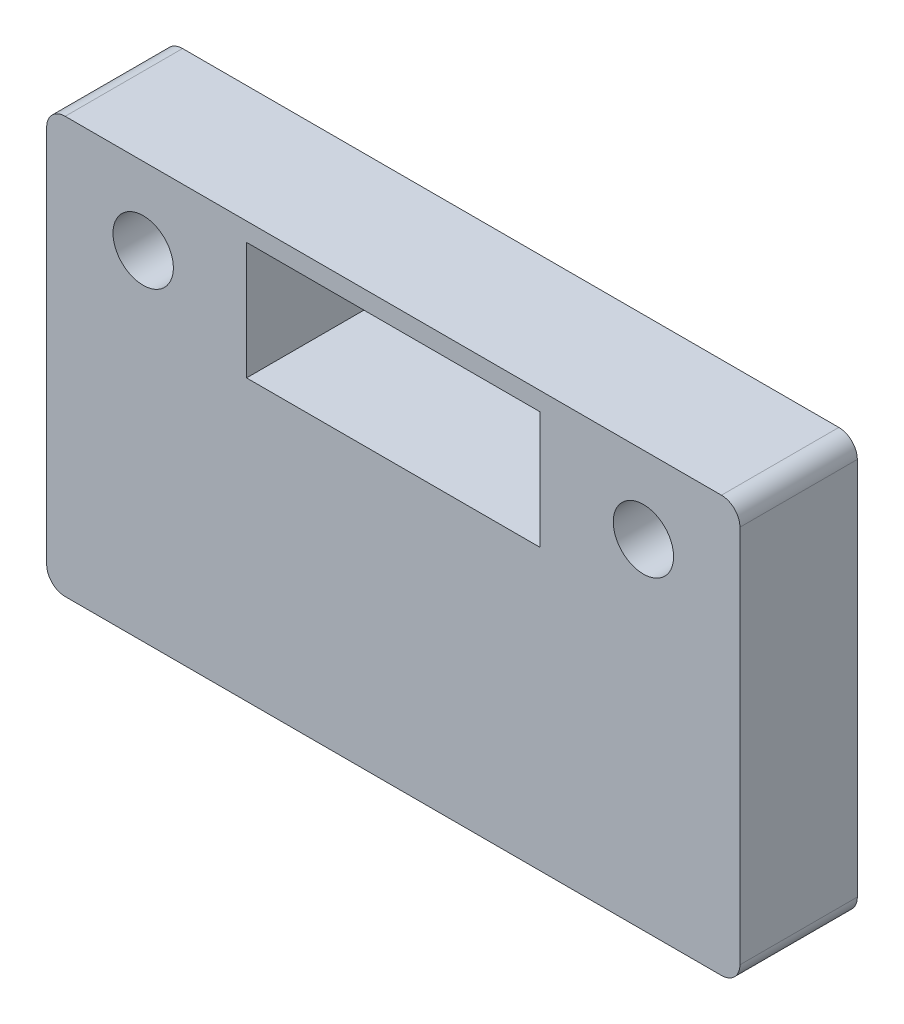
ISO-10303-21;
HEADER;
FILE_DESCRIPTION(('STEP AP214'),'2;1');
FILE_NAME('part.step','',(''),(''),'','','');
FILE_SCHEMA(('AUTOMOTIVE_DESIGN { 1 0 10303 214 1 1 1 1 }'));
ENDSEC;
DATA;
#1=APPLICATION_CONTEXT('core data for automotive mechanical design processes');
#2=APPLICATION_PROTOCOL_DEFINITION('international standard','automotive_design',2000,#1);
#3=PRODUCT_CONTEXT('',#1,'mechanical');
#4=PRODUCT('Part','Part','',(#3));
#5=PRODUCT_RELATED_PRODUCT_CATEGORY('part','',(#4));
#6=PRODUCT_DEFINITION_FORMATION('','',#4);
#7=PRODUCT_DEFINITION_CONTEXT('part definition',#1,'design');
#8=PRODUCT_DEFINITION('design','',#6,#7);
#9=PRODUCT_DEFINITION_SHAPE('','',#8);
#10=(LENGTH_UNIT() NAMED_UNIT(*) SI_UNIT(.MILLI.,.METRE.));
#11=(NAMED_UNIT(*) PLANE_ANGLE_UNIT() SI_UNIT($,.RADIAN.));
#12=(NAMED_UNIT(*) SI_UNIT($,.STERADIAN.) SOLID_ANGLE_UNIT());
#13=UNCERTAINTY_MEASURE_WITH_UNIT(LENGTH_MEASURE(1.E-05),#10,'distance_accuracy_value','');
#14=(GEOMETRIC_REPRESENTATION_CONTEXT(3) GLOBAL_UNCERTAINTY_ASSIGNED_CONTEXT((#13)) GLOBAL_UNIT_ASSIGNED_CONTEXT((#10,
#11,#12)) REPRESENTATION_CONTEXT('',''));
#15=CARTESIAN_POINT('',(0.,0.,0.));
#16=DIRECTION('',(0.,0.,1.));
#17=DIRECTION('',(1.,0.,0.));
#18=AXIS2_PLACEMENT_3D('',#15,#16,#17);
#19=CARTESIAN_POINT('',(0.,0.,12.7));
#20=DIRECTION('',(0.,0.,1.));
#21=DIRECTION('',(1.,0.,0.));
#22=AXIS2_PLACEMENT_3D('',#19,#20,#21);
#23=PLANE('',#22);
#24=CARTESIAN_POINT('',(64.56,-8.35,12.7));
#25=DIRECTION('',(0.,0.,-1.));
#26=DIRECTION('',(-1.,0.,0.));
#27=AXIS2_PLACEMENT_3D('',#24,#25,#26);
#28=CIRCLE('',#27,3.26389999999999);
#29=CARTESIAN_POINT('',(61.2961,-8.35,12.7));
#30=VERTEX_POINT('',#29);
#31=EDGE_CURVE('E467',#30,#30,#28,.T.);
#32=ORIENTED_EDGE('',*,*,#31,.T.);
#33=EDGE_LOOP('',(#32));
#34=FACE_BOUND('',#33,.T.);
#35=CARTESIAN_POINT('',(10.44,-8.35,12.7));
#36=DIRECTION('',(0.,0.,-1.));
#37=DIRECTION('',(-1.,0.,0.));
#38=AXIS2_PLACEMENT_3D('',#35,#36,#37);
#39=CIRCLE('',#38,3.26389999999999);
#40=CARTESIAN_POINT('',(7.17610000000001,-8.35,12.7));
#41=VERTEX_POINT('',#40);
#42=EDGE_CURVE('E170',#41,#41,#39,.T.);
#43=ORIENTED_EDGE('',*,*,#42,.T.);
#44=EDGE_LOOP('',(#43));
#45=FACE_BOUND('',#44,.T.);
#46=DIRECTION('',(1.,0.,0.));
#47=VECTOR('',#46,1.);
#48=CARTESIAN_POINT('',(0.,-45.,12.7));
#49=LINE('',#48,#47);
#50=CARTESIAN_POINT('',(2.00000000000001,-45.,12.7));
#51=VERTEX_POINT('',#50);
#52=CARTESIAN_POINT('',(73.,-45.,12.7));
#53=VERTEX_POINT('',#52);
#54=EDGE_CURVE('E191',#51,#53,#49,.T.);
#55=ORIENTED_EDGE('',*,*,#54,.T.);
#56=CARTESIAN_POINT('',(73.,-43.,12.7));
#57=DIRECTION('',(0.,0.,1.));
#58=DIRECTION('',(1.,0.,0.));
#59=AXIS2_PLACEMENT_3D('',#56,#57,#58);
#60=CIRCLE('',#59,2.);
#61=CARTESIAN_POINT('',(75.,-43.,12.7));
#62=VERTEX_POINT('',#61);
#63=EDGE_CURVE('E48',#53,#62,#60,.T.);
#64=ORIENTED_EDGE('',*,*,#63,.T.);
#65=DIRECTION('',(0.,1.,0.));
#66=VECTOR('',#65,1.);
#67=CARTESIAN_POINT('',(75.,0.,12.7));
#68=LINE('',#67,#66);
#69=CARTESIAN_POINT('',(75.,-2.,12.7));
#70=VERTEX_POINT('',#69);
#71=EDGE_CURVE('E195',#62,#70,#68,.T.);
#72=ORIENTED_EDGE('',*,*,#71,.T.);
#73=CARTESIAN_POINT('',(73.,-2.,12.7));
#74=DIRECTION('',(0.,0.,1.));
#75=DIRECTION('',(1.,0.,0.));
#76=AXIS2_PLACEMENT_3D('',#73,#74,#75);
#77=CIRCLE('',#76,2.);
#78=CARTESIAN_POINT('',(73.,0.,12.7));
#79=VERTEX_POINT('',#78);
#80=EDGE_CURVE('E55',#70,#79,#77,.T.);
#81=ORIENTED_EDGE('',*,*,#80,.T.);
#82=DIRECTION('',(-1.,0.,0.));
#83=VECTOR('',#82,1.);
#84=CARTESIAN_POINT('',(0.,0.,12.7));
#85=LINE('',#84,#83);
#86=CARTESIAN_POINT('',(2.,0.,12.7));
#87=VERTEX_POINT('',#86);
#88=EDGE_CURVE('E198',#79,#87,#85,.T.);
#89=ORIENTED_EDGE('',*,*,#88,.T.);
#90=CARTESIAN_POINT('',(2.,-2.,12.7));
#91=DIRECTION('',(0.,0.,1.));
#92=DIRECTION('',(1.,0.,0.));
#93=AXIS2_PLACEMENT_3D('',#90,#91,#92);
#94=CIRCLE('',#93,2.);
#95=CARTESIAN_POINT('',(0.,-2.,12.7));
#96=VERTEX_POINT('',#95);
#97=EDGE_CURVE('E234',#87,#96,#94,.T.);
#98=ORIENTED_EDGE('',*,*,#97,.T.);
#99=DIRECTION('',(0.,-1.,0.));
#100=VECTOR('',#99,1.);
#101=CARTESIAN_POINT('',(0.,0.,12.7));
#102=LINE('',#101,#100);
#103=CARTESIAN_POINT('',(0.,-43.,12.7));
#104=VERTEX_POINT('',#103);
#105=EDGE_CURVE('E187',#96,#104,#102,.T.);
#106=ORIENTED_EDGE('',*,*,#105,.T.);
#107=CARTESIAN_POINT('',(2.00000000000001,-43.,12.7));
#108=DIRECTION('',(0.,0.,1.));
#109=DIRECTION('',(1.,0.,0.));
#110=AXIS2_PLACEMENT_3D('',#107,#108,#109);
#111=CIRCLE('',#110,2.);
#112=EDGE_CURVE('E231',#104,#51,#111,.T.);
#113=ORIENTED_EDGE('',*,*,#112,.T.);
#114=EDGE_LOOP('',(#55,#64,#72,#81,#89,#98,#106,#113));
#115=FACE_BOUND('',#114,.T.);
#116=DIRECTION('',(1.,0.,0.));
#117=VECTOR('',#116,1.);
#118=CARTESIAN_POINT('',(53.375,-14.7,12.7));
#119=LINE('',#118,#117);
#120=CARTESIAN_POINT('',(21.625,-14.7,12.7));
#121=VERTEX_POINT('',#120);
#122=CARTESIAN_POINT('',(53.375,-14.7,12.7));
#123=VERTEX_POINT('',#122);
#124=EDGE_CURVE('E157',#121,#123,#119,.T.);
#125=ORIENTED_EDGE('',*,*,#124,.F.);
#126=DIRECTION('',(0.,-1.,0.));
#127=VECTOR('',#126,1.);
#128=CARTESIAN_POINT('',(21.625,-14.7,12.7));
#129=LINE('',#128,#127);
#130=CARTESIAN_POINT('',(21.625,-2.,12.7));
#131=VERTEX_POINT('',#130);
#132=EDGE_CURVE('E143',#131,#121,#129,.T.);
#133=ORIENTED_EDGE('',*,*,#132,.F.);
#134=DIRECTION('',(-1.,0.,0.));
#135=VECTOR('',#134,1.);
#136=CARTESIAN_POINT('',(21.625,-2.,12.7));
#137=LINE('',#136,#135);
#138=CARTESIAN_POINT('',(53.375,-2.,12.7));
#139=VERTEX_POINT('',#138);
#140=EDGE_CURVE('E131',#139,#131,#137,.T.);
#141=ORIENTED_EDGE('',*,*,#140,.F.);
#142=DIRECTION('',(0.,1.,0.));
#143=VECTOR('',#142,1.);
#144=CARTESIAN_POINT('',(53.375,-2.,12.7));
#145=LINE('',#144,#143);
#146=EDGE_CURVE('E161',#123,#139,#145,.T.);
#147=ORIENTED_EDGE('',*,*,#146,.F.);
#148=EDGE_LOOP('',(#125,#133,#141,#147));
#149=FACE_BOUND('',#148,.T.);
#150=ADVANCED_FACE('F39',(#34,#45,#115,#149),#23,.T.);
#151=CARTESIAN_POINT('',(0.,0.,0.));
#152=DIRECTION('',(0.,0.,1.));
#153=DIRECTION('',(1.,0.,0.));
#154=AXIS2_PLACEMENT_3D('',#151,#152,#153);
#155=PLANE('',#154);
#156=CARTESIAN_POINT('',(64.56,-8.35,0.));
#157=DIRECTION('',(0.,0.,-1.));
#158=DIRECTION('',(-1.,0.,0.));
#159=AXIS2_PLACEMENT_3D('',#156,#157,#158);
#160=CIRCLE('',#159,6.4389);
#161=CARTESIAN_POINT('',(58.1211,-8.35,0.));
#162=VERTEX_POINT('',#161);
#163=EDGE_CURVE('E476',#162,#162,#160,.T.);
#164=ORIENTED_EDGE('',*,*,#163,.F.);
#165=EDGE_LOOP('',(#164));
#166=FACE_BOUND('',#165,.T.);
#167=CARTESIAN_POINT('',(10.44,-8.35,0.));
#168=DIRECTION('',(0.,0.,-1.));
#169=DIRECTION('',(-1.,0.,0.));
#170=AXIS2_PLACEMENT_3D('',#167,#168,#169);
#171=CIRCLE('',#170,6.4389);
#172=CARTESIAN_POINT('',(4.0011,-8.35,0.));
#173=VERTEX_POINT('',#172);
#174=EDGE_CURVE('E462',#173,#173,#171,.T.);
#175=ORIENTED_EDGE('',*,*,#174,.F.);
#176=EDGE_LOOP('',(#175));
#177=FACE_BOUND('',#176,.T.);
#178=DIRECTION('',(0.,1.,0.));
#179=VECTOR('',#178,1.);
#180=CARTESIAN_POINT('',(75.,0.,0.));
#181=LINE('',#180,#179);
#182=CARTESIAN_POINT('',(75.,-43.,0.));
#183=VERTEX_POINT('',#182);
#184=CARTESIAN_POINT('',(75.,-2.,0.));
#185=VERTEX_POINT('',#184);
#186=EDGE_CURVE('E208',#183,#185,#181,.T.);
#187=ORIENTED_EDGE('',*,*,#186,.F.);
#188=CARTESIAN_POINT('',(73.,-43.,0.));
#189=DIRECTION('',(0.,0.,1.));
#190=DIRECTION('',(1.,0.,0.));
#191=AXIS2_PLACEMENT_3D('',#188,#189,#190);
#192=CIRCLE('',#191,2.);
#193=CARTESIAN_POINT('',(73.,-45.,0.));
#194=VERTEX_POINT('',#193);
#195=EDGE_CURVE('E251',#183,#194,#192,.F.);
#196=ORIENTED_EDGE('',*,*,#195,.T.);
#197=DIRECTION('',(1.,0.,0.));
#198=VECTOR('',#197,1.);
#199=CARTESIAN_POINT('',(0.,-45.,0.));
#200=LINE('',#199,#198);
#201=CARTESIAN_POINT('',(2.00000000000001,-45.,0.));
#202=VERTEX_POINT('',#201);
#203=EDGE_CURVE('E205',#202,#194,#200,.T.);
#204=ORIENTED_EDGE('',*,*,#203,.F.);
#205=CARTESIAN_POINT('',(2.00000000000001,-43.,0.));
#206=DIRECTION('',(0.,0.,1.));
#207=DIRECTION('',(1.,0.,0.));
#208=AXIS2_PLACEMENT_3D('',#205,#206,#207);
#209=CIRCLE('',#208,2.);
#210=CARTESIAN_POINT('',(0.,-43.,0.));
#211=VERTEX_POINT('',#210);
#212=EDGE_CURVE('E220',#202,#211,#209,.F.);
#213=ORIENTED_EDGE('',*,*,#212,.T.);
#214=DIRECTION('',(0.,-1.,0.));
#215=VECTOR('',#214,1.);
#216=CARTESIAN_POINT('',(0.,0.,0.));
#217=LINE('',#216,#215);
#218=CARTESIAN_POINT('',(0.,-2.,0.));
#219=VERTEX_POINT('',#218);
#220=EDGE_CURVE('E153',#219,#211,#217,.T.);
#221=ORIENTED_EDGE('',*,*,#220,.F.);
#222=CARTESIAN_POINT('',(2.,-2.,0.));
#223=DIRECTION('',(0.,0.,1.));
#224=DIRECTION('',(1.,0.,0.));
#225=AXIS2_PLACEMENT_3D('',#222,#223,#224);
#226=CIRCLE('',#225,2.);
#227=CARTESIAN_POINT('',(2.,0.,0.));
#228=VERTEX_POINT('',#227);
#229=EDGE_CURVE('E223',#219,#228,#226,.F.);
#230=ORIENTED_EDGE('',*,*,#229,.T.);
#231=DIRECTION('',(-1.,0.,0.));
#232=VECTOR('',#231,1.);
#233=CARTESIAN_POINT('',(0.,0.,0.));
#234=LINE('',#233,#232);
#235=CARTESIAN_POINT('',(73.,0.,0.));
#236=VERTEX_POINT('',#235);
#237=EDGE_CURVE('E192',#236,#228,#234,.T.);
#238=ORIENTED_EDGE('',*,*,#237,.F.);
#239=CARTESIAN_POINT('',(73.,-2.,0.));
#240=DIRECTION('',(0.,0.,1.));
#241=DIRECTION('',(1.,0.,0.));
#242=AXIS2_PLACEMENT_3D('',#239,#240,#241);
#243=CIRCLE('',#242,2.);
#244=EDGE_CURVE('E248',#236,#185,#243,.F.);
#245=ORIENTED_EDGE('',*,*,#244,.T.);
#246=EDGE_LOOP('',(#187,#196,#204,#213,#221,#230,#238,#245));
#247=FACE_BOUND('',#246,.T.);
#248=DIRECTION('',(0.,-1.,0.));
#249=VECTOR('',#248,1.);
#250=CARTESIAN_POINT('',(21.625,-14.7,0.));
#251=LINE('',#250,#249);
#252=CARTESIAN_POINT('',(21.625,-2.,0.));
#253=VERTEX_POINT('',#252);
#254=CARTESIAN_POINT('',(21.625,-14.7,0.));
#255=VERTEX_POINT('',#254);
#256=EDGE_CURVE('E150',#253,#255,#251,.T.);
#257=ORIENTED_EDGE('',*,*,#256,.T.);
#258=DIRECTION('',(1.,0.,0.));
#259=VECTOR('',#258,1.);
#260=CARTESIAN_POINT('',(53.375,-14.7,0.));
#261=LINE('',#260,#259);
#262=CARTESIAN_POINT('',(53.375,-14.7,0.));
#263=VERTEX_POINT('',#262);
#264=EDGE_CURVE('E169',#255,#263,#261,.T.);
#265=ORIENTED_EDGE('',*,*,#264,.T.);
#266=DIRECTION('',(0.,1.,0.));
#267=VECTOR('',#266,1.);
#268=CARTESIAN_POINT('',(53.375,-2.,0.));
#269=LINE('',#268,#267);
#270=CARTESIAN_POINT('',(53.375,-2.,0.));
#271=VERTEX_POINT('',#270);
#272=EDGE_CURVE('E174',#263,#271,#269,.T.);
#273=ORIENTED_EDGE('',*,*,#272,.T.);
#274=DIRECTION('',(-1.,0.,0.));
#275=VECTOR('',#274,1.);
#276=CARTESIAN_POINT('',(37.5,-2.,0.));
#277=LINE('',#276,#275);
#278=EDGE_CURVE('E144',#271,#253,#277,.T.);
#279=ORIENTED_EDGE('',*,*,#278,.T.);
#280=EDGE_LOOP('',(#257,#265,#273,#279));
#281=FACE_BOUND('',#280,.T.);
#282=ADVANCED_FACE('F269',(#166,#177,#247,#281),#155,.F.);
#283=CARTESIAN_POINT('',(0.,0.,12.7));
#284=DIRECTION('',(1.,0.,0.));
#285=DIRECTION('',(0.,1.,0.));
#286=AXIS2_PLACEMENT_3D('',#283,#284,#285);
#287=PLANE('',#286);
#288=ORIENTED_EDGE('',*,*,#105,.F.);
#289=DIRECTION('',(0.,0.,-1.));
#290=VECTOR('',#289,1.);
#291=CARTESIAN_POINT('',(0.,-2.,12.7));
#292=LINE('',#291,#290);
#293=EDGE_CURVE('E216',#96,#219,#292,.T.);
#294=ORIENTED_EDGE('',*,*,#293,.T.);
#295=ORIENTED_EDGE('',*,*,#220,.T.);
#296=DIRECTION('',(0.,0.,-1.));
#297=VECTOR('',#296,1.);
#298=CARTESIAN_POINT('',(0.,-43.,12.7));
#299=LINE('',#298,#297);
#300=EDGE_CURVE('E201',#211,#104,#299,.F.);
#301=ORIENTED_EDGE('',*,*,#300,.T.);
#302=EDGE_LOOP('',(#288,#294,#295,#301));
#303=FACE_BOUND('',#302,.T.);
#304=ADVANCED_FACE('F280',(#303),#287,.F.);
#305=CARTESIAN_POINT('',(0.,-45.,12.7));
#306=DIRECTION('',(0.,1.,0.));
#307=DIRECTION('',(0.,0.,1.));
#308=AXIS2_PLACEMENT_3D('',#305,#306,#307);
#309=PLANE('',#308);
#310=ORIENTED_EDGE('',*,*,#203,.T.);
#311=DIRECTION('',(0.,0.,-1.));
#312=VECTOR('',#311,1.);
#313=CARTESIAN_POINT('',(73.,-45.,12.7));
#314=LINE('',#313,#312);
#315=EDGE_CURVE('E63',#194,#53,#314,.F.);
#316=ORIENTED_EDGE('',*,*,#315,.T.);
#317=ORIENTED_EDGE('',*,*,#54,.F.);
#318=DIRECTION('',(0.,0.,-1.));
#319=VECTOR('',#318,1.);
#320=CARTESIAN_POINT('',(2.00000000000001,-45.,12.7));
#321=LINE('',#320,#319);
#322=EDGE_CURVE('E237',#51,#202,#321,.T.);
#323=ORIENTED_EDGE('',*,*,#322,.T.);
#324=EDGE_LOOP('',(#310,#316,#317,#323));
#325=FACE_BOUND('',#324,.T.);
#326=ADVANCED_FACE('F271',(#325),#309,.F.);
#327=CARTESIAN_POINT('',(75.,0.,12.7));
#328=DIRECTION('',(-1.,0.,0.));
#329=DIRECTION('',(0.,0.,1.));
#330=AXIS2_PLACEMENT_3D('',#327,#328,#329);
#331=PLANE('',#330);
#332=ORIENTED_EDGE('',*,*,#71,.F.);
#333=DIRECTION('',(0.,0.,-1.));
#334=VECTOR('',#333,1.);
#335=CARTESIAN_POINT('',(75.,-43.,12.7));
#336=LINE('',#335,#334);
#337=EDGE_CURVE('E244',#62,#183,#336,.T.);
#338=ORIENTED_EDGE('',*,*,#337,.T.);
#339=ORIENTED_EDGE('',*,*,#186,.T.);
#340=DIRECTION('',(0.,0.,-1.));
#341=VECTOR('',#340,1.);
#342=CARTESIAN_POINT('',(75.,-2.,12.7));
#343=LINE('',#342,#341);
#344=EDGE_CURVE('E241',#185,#70,#343,.F.);
#345=ORIENTED_EDGE('',*,*,#344,.T.);
#346=EDGE_LOOP('',(#332,#338,#339,#345));
#347=FACE_BOUND('',#346,.T.);
#348=ADVANCED_FACE('F263',(#347),#331,.F.);
#349=CARTESIAN_POINT('',(0.,0.,12.7));
#350=DIRECTION('',(0.,-1.,0.));
#351=DIRECTION('',(0.,0.,-1.));
#352=AXIS2_PLACEMENT_3D('',#349,#350,#351);
#353=PLANE('',#352);
#354=ORIENTED_EDGE('',*,*,#88,.F.);
#355=DIRECTION('',(0.,0.,-1.));
#356=VECTOR('',#355,1.);
#357=CARTESIAN_POINT('',(73.,0.,12.7));
#358=LINE('',#357,#356);
#359=EDGE_CURVE('E11',#79,#236,#358,.T.);
#360=ORIENTED_EDGE('',*,*,#359,.T.);
#361=ORIENTED_EDGE('',*,*,#237,.T.);
#362=DIRECTION('',(0.,0.,-1.));
#363=VECTOR('',#362,1.);
#364=CARTESIAN_POINT('',(2.,0.,12.7));
#365=LINE('',#364,#363);
#366=EDGE_CURVE('E227',#228,#87,#365,.F.);
#367=ORIENTED_EDGE('',*,*,#366,.T.);
#368=EDGE_LOOP('',(#354,#360,#361,#367));
#369=FACE_BOUND('',#368,.T.);
#370=ADVANCED_FACE('F288',(#369),#353,.F.);
#371=CARTESIAN_POINT('',(21.625,-14.7,12.7));
#372=DIRECTION('',(1.,0.,0.));
#373=DIRECTION('',(0.,1.,0.));
#374=AXIS2_PLACEMENT_3D('',#371,#372,#373);
#375=PLANE('',#374);
#376=ORIENTED_EDGE('',*,*,#256,.F.);
#377=DIRECTION('',(0.,0.,-1.));
#378=VECTOR('',#377,1.);
#379=CARTESIAN_POINT('',(21.625,-2.,12.7));
#380=LINE('',#379,#378);
#381=EDGE_CURVE('E135',#131,#253,#380,.T.);
#382=ORIENTED_EDGE('',*,*,#381,.F.);
#383=ORIENTED_EDGE('',*,*,#132,.T.);
#384=DIRECTION('',(0.,0.,-1.));
#385=VECTOR('',#384,1.);
#386=CARTESIAN_POINT('',(21.625,-14.7,12.7));
#387=LINE('',#386,#385);
#388=EDGE_CURVE('E154',#121,#255,#387,.T.);
#389=ORIENTED_EDGE('',*,*,#388,.T.);
#390=EDGE_LOOP('',(#376,#382,#383,#389));
#391=FACE_BOUND('',#390,.T.);
#392=ADVANCED_FACE('F147',(#391),#375,.T.);
#393=CARTESIAN_POINT('',(53.375,-14.7,12.7));
#394=DIRECTION('',(0.,1.,0.));
#395=DIRECTION('',(-1.,0.,0.));
#396=AXIS2_PLACEMENT_3D('',#393,#394,#395);
#397=PLANE('',#396);
#398=ORIENTED_EDGE('',*,*,#264,.F.);
#399=ORIENTED_EDGE('',*,*,#388,.F.);
#400=ORIENTED_EDGE('',*,*,#124,.T.);
#401=DIRECTION('',(0.,0.,-1.));
#402=VECTOR('',#401,1.);
#403=CARTESIAN_POINT('',(53.375,-14.7,12.7));
#404=LINE('',#403,#402);
#405=EDGE_CURVE('E182',#123,#263,#404,.T.);
#406=ORIENTED_EDGE('',*,*,#405,.T.);
#407=EDGE_LOOP('',(#398,#399,#400,#406));
#408=FACE_BOUND('',#407,.T.);
#409=ADVANCED_FACE('F430',(#408),#397,.T.);
#410=CARTESIAN_POINT('',(53.375,-2.,12.7));
#411=DIRECTION('',(-1.,0.,0.));
#412=DIRECTION('',(0.,-1.,0.));
#413=AXIS2_PLACEMENT_3D('',#410,#411,#412);
#414=PLANE('',#413);
#415=ORIENTED_EDGE('',*,*,#272,.F.);
#416=ORIENTED_EDGE('',*,*,#405,.F.);
#417=ORIENTED_EDGE('',*,*,#146,.T.);
#418=DIRECTION('',(0.,0.,-1.));
#419=VECTOR('',#418,1.);
#420=CARTESIAN_POINT('',(53.375,-2.,12.7));
#421=LINE('',#420,#419);
#422=EDGE_CURVE('E137',#139,#271,#421,.T.);
#423=ORIENTED_EDGE('',*,*,#422,.T.);
#424=EDGE_LOOP('',(#415,#416,#417,#423));
#425=FACE_BOUND('',#424,.T.);
#426=ADVANCED_FACE('F419',(#425),#414,.T.);
#427=CARTESIAN_POINT('',(37.5,-2.,12.7));
#428=DIRECTION('',(0.,-1.,0.));
#429=DIRECTION('',(1.,0.,0.));
#430=AXIS2_PLACEMENT_3D('',#427,#428,#429);
#431=PLANE('',#430);
#432=ORIENTED_EDGE('',*,*,#278,.F.);
#433=ORIENTED_EDGE('',*,*,#422,.F.);
#434=ORIENTED_EDGE('',*,*,#140,.T.);
#435=ORIENTED_EDGE('',*,*,#381,.T.);
#436=EDGE_LOOP('',(#432,#433,#434,#435));
#437=FACE_BOUND('',#436,.T.);
#438=ADVANCED_FACE('F134',(#437),#431,.T.);
#439=CARTESIAN_POINT('',(10.44,-8.35,0.));
#440=DIRECTION('',(0.,0.,-1.));
#441=DIRECTION('',(-1.,0.,0.));
#442=AXIS2_PLACEMENT_3D('',#439,#440,#441);
#443=CYLINDRICAL_SURFACE('',#442,3.26389999999999);
#444=ORIENTED_EDGE('',*,*,#42,.F.);
#445=EDGE_LOOP('',(#444));
#446=FACE_BOUND('',#445,.T.);
#447=CARTESIAN_POINT('',(10.44,-8.35,3.65241969292671));
#448=DIRECTION('',(0.,0.,-1.));
#449=DIRECTION('',(-1.,0.,0.));
#450=AXIS2_PLACEMENT_3D('',#447,#448,#449);
#451=CIRCLE('',#450,3.26389999999999);
#452=CARTESIAN_POINT('',(7.17610000000001,-8.35,3.65241969292671));
#453=VERTEX_POINT('',#452);
#454=EDGE_CURVE('E460',#453,#453,#451,.T.);
#455=ORIENTED_EDGE('',*,*,#454,.T.);
#456=EDGE_LOOP('',(#455));
#457=FACE_BOUND('',#456,.T.);
#458=ADVANCED_FACE('F402',(#446,#457),#443,.F.);
#459=CARTESIAN_POINT('',(10.44,-8.35,0.));
#460=DIRECTION('',(0.,0.,-1.));
#461=DIRECTION('',(-1.,0.,0.));
#462=AXIS2_PLACEMENT_3D('',#459,#460,#461);
#463=CONICAL_SURFACE('',#462,6.4389,0.715584993317677);
#464=ORIENTED_EDGE('',*,*,#454,.F.);
#465=EDGE_LOOP('',(#464));
#466=FACE_BOUND('',#465,.T.);
#467=ORIENTED_EDGE('',*,*,#174,.T.);
#468=EDGE_LOOP('',(#467));
#469=FACE_BOUND('',#468,.T.);
#470=ADVANCED_FACE('F393',(#466,#469),#463,.F.);
#471=CARTESIAN_POINT('',(64.56,-8.35,0.));
#472=DIRECTION('',(0.,0.,-1.));
#473=DIRECTION('',(-1.,0.,0.));
#474=AXIS2_PLACEMENT_3D('',#471,#472,#473);
#475=CYLINDRICAL_SURFACE('',#474,3.26389999999999);
#476=ORIENTED_EDGE('',*,*,#31,.F.);
#477=EDGE_LOOP('',(#476));
#478=FACE_BOUND('',#477,.T.);
#479=CARTESIAN_POINT('',(64.56,-8.35,3.65241969292671));
#480=DIRECTION('',(0.,0.,-1.));
#481=DIRECTION('',(-1.,0.,0.));
#482=AXIS2_PLACEMENT_3D('',#479,#480,#481);
#483=CIRCLE('',#482,3.26389999999999);
#484=CARTESIAN_POINT('',(61.2961,-8.35,3.65241969292671));
#485=VERTEX_POINT('',#484);
#486=EDGE_CURVE('E472',#485,#485,#483,.T.);
#487=ORIENTED_EDGE('',*,*,#486,.T.);
#488=EDGE_LOOP('',(#487));
#489=FACE_BOUND('',#488,.T.);
#490=ADVANCED_FACE('F386',(#478,#489),#475,.F.);
#491=CARTESIAN_POINT('',(64.56,-8.35,0.));
#492=DIRECTION('',(0.,0.,-1.));
#493=DIRECTION('',(-1.,0.,0.));
#494=AXIS2_PLACEMENT_3D('',#491,#492,#493);
#495=CONICAL_SURFACE('',#494,6.4389,0.715584993317677);
#496=ORIENTED_EDGE('',*,*,#486,.F.);
#497=EDGE_LOOP('',(#496));
#498=FACE_BOUND('',#497,.T.);
#499=ORIENTED_EDGE('',*,*,#163,.T.);
#500=EDGE_LOOP('',(#499));
#501=FACE_BOUND('',#500,.T.);
#502=ADVANCED_FACE('F318',(#498,#501),#495,.F.);
#503=CARTESIAN_POINT('',(2.,-2.,12.7));
#504=DIRECTION('',(0.,0.,-1.));
#505=DIRECTION('',(-1.,0.,0.));
#506=AXIS2_PLACEMENT_3D('',#503,#504,#505);
#507=CYLINDRICAL_SURFACE('',#506,2.);
#508=ORIENTED_EDGE('',*,*,#97,.F.);
#509=ORIENTED_EDGE('',*,*,#366,.F.);
#510=ORIENTED_EDGE('',*,*,#229,.F.);
#511=ORIENTED_EDGE('',*,*,#293,.F.);
#512=EDGE_LOOP('',(#508,#509,#510,#511));
#513=FACE_BOUND('',#512,.T.);
#514=ADVANCED_FACE('F284',(#513),#507,.T.);
#515=CARTESIAN_POINT('',(2.00000000000001,-43.,12.7));
#516=DIRECTION('',(0.,0.,-1.));
#517=DIRECTION('',(-1.,0.,0.));
#518=AXIS2_PLACEMENT_3D('',#515,#516,#517);
#519=CYLINDRICAL_SURFACE('',#518,2.);
#520=ORIENTED_EDGE('',*,*,#112,.F.);
#521=ORIENTED_EDGE('',*,*,#300,.F.);
#522=ORIENTED_EDGE('',*,*,#212,.F.);
#523=ORIENTED_EDGE('',*,*,#322,.F.);
#524=EDGE_LOOP('',(#520,#521,#522,#523));
#525=FACE_BOUND('',#524,.T.);
#526=ADVANCED_FACE('F275',(#525),#519,.T.);
#527=CARTESIAN_POINT('',(73.,-43.,12.7));
#528=DIRECTION('',(0.,0.,-1.));
#529=DIRECTION('',(-1.,0.,0.));
#530=AXIS2_PLACEMENT_3D('',#527,#528,#529);
#531=CYLINDRICAL_SURFACE('',#530,2.);
#532=ORIENTED_EDGE('',*,*,#63,.F.);
#533=ORIENTED_EDGE('',*,*,#315,.F.);
#534=ORIENTED_EDGE('',*,*,#195,.F.);
#535=ORIENTED_EDGE('',*,*,#337,.F.);
#536=EDGE_LOOP('',(#532,#533,#534,#535));
#537=FACE_BOUND('',#536,.T.);
#538=ADVANCED_FACE('F266',(#537),#531,.T.);
#539=CARTESIAN_POINT('',(73.,-2.,12.7));
#540=DIRECTION('',(0.,0.,-1.));
#541=DIRECTION('',(-1.,0.,0.));
#542=AXIS2_PLACEMENT_3D('',#539,#540,#541);
#543=CYLINDRICAL_SURFACE('',#542,2.);
#544=ORIENTED_EDGE('',*,*,#80,.F.);
#545=ORIENTED_EDGE('',*,*,#344,.F.);
#546=ORIENTED_EDGE('',*,*,#244,.F.);
#547=ORIENTED_EDGE('',*,*,#359,.F.);
#548=EDGE_LOOP('',(#544,#545,#546,#547));
#549=FACE_BOUND('',#548,.T.);
#550=ADVANCED_FACE('F41',(#549),#543,.T.);
#551=CLOSED_SHELL('',(#150,#282,#304,#326,#348,#370,#392,#409,#426,#438,#458,#470,#490,#502,
#514,#526,#538,#550));
#552=MANIFOLD_SOLID_BREP('B2',#551);
#553=ADVANCED_BREP_SHAPE_REPRESENTATION('',(#18,#552),#14);
#554=SHAPE_DEFINITION_REPRESENTATION(#9,#553);
ENDSEC;
END-ISO-10303-21;
